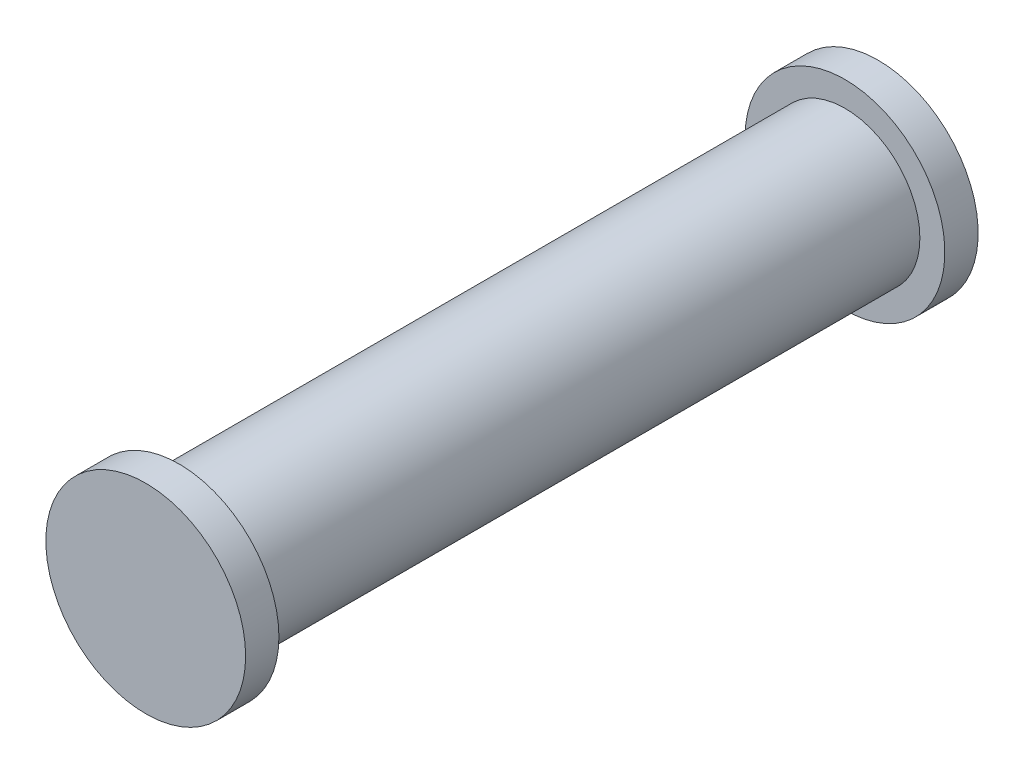
ISO-10303-21;
HEADER;
FILE_DESCRIPTION(('STEP AP214'),'2;1');
FILE_NAME('part.step','',(''),(''),'','','');
FILE_SCHEMA(('AUTOMOTIVE_DESIGN { 1 0 10303 214 1 1 1 1 }'));
ENDSEC;
DATA;
#1=APPLICATION_CONTEXT('core data for automotive mechanical design processes');
#2=APPLICATION_PROTOCOL_DEFINITION('international standard','automotive_design',2000,#1);
#3=PRODUCT_CONTEXT('',#1,'mechanical');
#4=PRODUCT('Part','Part','',(#3));
#5=PRODUCT_RELATED_PRODUCT_CATEGORY('part','',(#4));
#6=PRODUCT_DEFINITION_FORMATION('','',#4);
#7=PRODUCT_DEFINITION_CONTEXT('part definition',#1,'design');
#8=PRODUCT_DEFINITION('design','',#6,#7);
#9=PRODUCT_DEFINITION_SHAPE('','',#8);
#10=(LENGTH_UNIT() NAMED_UNIT(*) SI_UNIT(.MILLI.,.METRE.));
#11=(NAMED_UNIT(*) PLANE_ANGLE_UNIT() SI_UNIT($,.RADIAN.));
#12=(NAMED_UNIT(*) SI_UNIT($,.STERADIAN.) SOLID_ANGLE_UNIT());
#13=UNCERTAINTY_MEASURE_WITH_UNIT(LENGTH_MEASURE(1.E-05),#10,'distance_accuracy_value','');
#14=(GEOMETRIC_REPRESENTATION_CONTEXT(3) GLOBAL_UNCERTAINTY_ASSIGNED_CONTEXT((#13)) GLOBAL_UNIT_ASSIGNED_CONTEXT((#10,
#11,#12)) REPRESENTATION_CONTEXT('',''));
#15=CARTESIAN_POINT('',(0.,0.,0.));
#16=DIRECTION('',(0.,0.,1.));
#17=DIRECTION('',(1.,0.,0.));
#18=AXIS2_PLACEMENT_3D('',#15,#16,#17);
#19=CARTESIAN_POINT('',(-14.9,15.1,-26.363961030679));
#20=DIRECTION('',(0.,0.,1.));
#21=DIRECTION('',(1.,0.,0.));
#22=AXIS2_PLACEMENT_3D('',#19,#20,#21);
#23=CYLINDRICAL_SURFACE('',#22,2.25);
#24=CARTESIAN_POINT('',(-14.9,15.1,-20.0000000000001));
#25=DIRECTION('',(0.,0.,1.));
#26=DIRECTION('',(1.,0.,0.));
#27=AXIS2_PLACEMENT_3D('',#24,#25,#26);
#28=CIRCLE('',#27,2.25);
#29=CARTESIAN_POINT('',(-12.65,15.1,-20.0000000000001));
#30=VERTEX_POINT('',#29);
#31=EDGE_CURVE('E10',#30,#30,#28,.F.);
#32=CARTESIAN_POINT('',(-14.9,15.1,0.));
#33=DIRECTION('',(0.,0.,1.));
#34=DIRECTION('',(1.,0.,0.));
#35=AXIS2_PLACEMENT_3D('',#32,#33,#34);
#36=CIRCLE('',#35,2.25);
#37=CARTESIAN_POINT('',(-12.65,15.1,0.));
#38=VERTEX_POINT('',#37);
#39=EDGE_CURVE('E36',#38,#38,#36,.T.);
#40=CARTESIAN_POINT('',(-12.65,15.1,-20.0000000000001));
#41=CARTESIAN_POINT('',(-12.65,15.1,-19.7916666666668));
#42=CARTESIAN_POINT('',(-12.65,15.1,-19.5833333333334));
#43=CARTESIAN_POINT('',(-12.65,15.1,-19.1666666666668));
#44=CARTESIAN_POINT('',(-12.65,15.1,-18.9583333333334));
#45=CARTESIAN_POINT('',(-12.65,15.1,-18.5416666666668));
#46=CARTESIAN_POINT('',(-12.65,15.1,-18.3333333333334));
#47=CARTESIAN_POINT('',(-12.65,15.1,-17.9166666666667));
#48=CARTESIAN_POINT('',(-12.65,15.1,-17.7083333333334));
#49=CARTESIAN_POINT('',(-12.65,15.1,-17.2916666666667));
#50=CARTESIAN_POINT('',(-12.65,15.1,-17.0833333333334));
#51=CARTESIAN_POINT('',(-12.65,15.1,-16.6666666666667));
#52=CARTESIAN_POINT('',(-12.65,15.1,-16.4583333333334));
#53=CARTESIAN_POINT('',(-12.65,15.1,-16.0416666666667));
#54=CARTESIAN_POINT('',(-12.65,15.1,-15.8333333333334));
#55=CARTESIAN_POINT('',(-12.65,15.1,-15.4166666666667));
#56=CARTESIAN_POINT('',(-12.65,15.1,-15.2083333333334));
#57=CARTESIAN_POINT('',(-12.65,15.1,-14.7916666666667));
#58=CARTESIAN_POINT('',(-12.65,15.1,-14.5833333333334));
#59=CARTESIAN_POINT('',(-12.65,15.1,-14.1666666666667));
#60=CARTESIAN_POINT('',(-12.65,15.1,-13.9583333333334));
#61=CARTESIAN_POINT('',(-12.65,15.1,-13.5416666666667));
#62=CARTESIAN_POINT('',(-12.65,15.1,-13.3333333333334));
#63=CARTESIAN_POINT('',(-12.65,15.1,-12.9166666666667));
#64=CARTESIAN_POINT('',(-12.65,15.1,-12.7083333333334));
#65=CARTESIAN_POINT('',(-12.65,15.1,-12.2916666666667));
#66=CARTESIAN_POINT('',(-12.65,15.1,-12.0833333333334));
#67=CARTESIAN_POINT('',(-12.65,15.1,-11.6666666666667));
#68=CARTESIAN_POINT('',(-12.65,15.1,-11.4583333333334));
#69=CARTESIAN_POINT('',(-12.65,15.1,-11.0416666666667));
#70=CARTESIAN_POINT('',(-12.65,15.1,-10.8333333333334));
#71=CARTESIAN_POINT('',(-12.65,15.1,-10.4166666666667));
#72=CARTESIAN_POINT('',(-12.65,15.1,-10.2083333333334));
#73=CARTESIAN_POINT('',(-12.65,15.1,-9.79166666666671));
#74=CARTESIAN_POINT('',(-12.65,15.1,-9.58333333333338));
#75=CARTESIAN_POINT('',(-12.65,15.1,-9.16666666666671));
#76=CARTESIAN_POINT('',(-12.65,15.1,-8.95833333333338));
#77=CARTESIAN_POINT('',(-12.65,15.1,-8.54166666666671));
#78=CARTESIAN_POINT('',(-12.65,15.1,-8.33333333333337));
#79=CARTESIAN_POINT('',(-12.65,15.1,-7.91666666666671));
#80=CARTESIAN_POINT('',(-12.65,15.1,-7.70833333333337));
#81=CARTESIAN_POINT('',(-12.65,15.1,-7.2916666666667));
#82=CARTESIAN_POINT('',(-12.65,15.1,-7.08333333333337));
#83=CARTESIAN_POINT('',(-12.65,15.1,-6.6666666666667));
#84=CARTESIAN_POINT('',(-12.65,15.1,-6.45833333333337));
#85=CARTESIAN_POINT('',(-12.65,15.1,-6.0416666666667));
#86=CARTESIAN_POINT('',(-12.65,15.1,-5.83333333333336));
#87=CARTESIAN_POINT('',(-12.65,15.1,-5.4166666666667));
#88=CARTESIAN_POINT('',(-12.65,15.1,-5.20833333333336));
#89=CARTESIAN_POINT('',(-12.65,15.1,-4.79166666666669));
#90=CARTESIAN_POINT('',(-12.65,15.1,-4.58333333333336));
#91=CARTESIAN_POINT('',(-12.65,15.1,-4.16666666666669));
#92=CARTESIAN_POINT('',(-12.65,15.1,-3.95833333333335));
#93=CARTESIAN_POINT('',(-12.65,15.1,-3.54166666666669));
#94=CARTESIAN_POINT('',(-12.65,15.1,-3.33333333333335));
#95=CARTESIAN_POINT('',(-12.65,15.1,-2.91666666666668));
#96=CARTESIAN_POINT('',(-12.65,15.1,-2.70833333333335));
#97=CARTESIAN_POINT('',(-12.65,15.1,-2.29166666666668));
#98=CARTESIAN_POINT('',(-12.65,15.1,-2.08333333333335));
#99=CARTESIAN_POINT('',(-12.65,15.1,-1.66666666666668));
#100=CARTESIAN_POINT('',(-12.65,15.1,-1.45833333333335));
#101=CARTESIAN_POINT('',(-12.65,15.1,-1.04166666666668));
#102=CARTESIAN_POINT('',(-12.65,15.1,-0.833333333333344));
#103=CARTESIAN_POINT('',(-12.65,15.1,-0.416666666666675));
#104=CARTESIAN_POINT('',(-12.65,15.1,-0.20833333333334));
#105=CARTESIAN_POINT('',(-12.65,15.1,0.));
#106=B_SPLINE_CURVE_WITH_KNOTS('',3,(#40,#41,#42,#43,#44,#45,#46,#47,#48,#49,#50,#51,#52,#53,
#54,#55,#56,#57,#58,#59,#60,#61,#62,#63,#64,#65,#66,#67,#68,#69,#70,#71,#72,#73,#74,#75,#76,#77,
#78,#79,#80,#81,#82,#83,#84,#85,#86,#87,#88,#89,#90,#91,#92,#93,#94,#95,#96,#97,#98,#99,#100,
#101,#102,#103,#104,#105),.UNSPECIFIED.,.F.,.F.,(4,2,2,2,2,2,2,2,2,2,2,2,2,2,2,2,2,2,2,2,2,2,2,
2,2,2,2,2,2,2,2,2,4),(0.,0.625000000000004,1.25,1.87500000000001,2.50000000000001,
3.12500000000001,3.75000000000001,4.37500000000002,5.00000000000002,5.62500000000002,
6.25000000000003,6.87500000000003,7.50000000000003,8.12500000000004,8.75000000000004,
9.37500000000004,10.,10.625,11.25,11.8750000000001,12.5000000000001,13.1250000000001,
13.7500000000001,14.3750000000001,15.0000000000001,15.6250000000001,16.2500000000001,
16.8750000000001,17.5000000000001,18.1250000000001,18.7500000000001,19.3750000000001,
20.0000000000001),.UNSPECIFIED.);
#107=EDGE_CURVE('BSEAM30',#30,#38,#106,.T.);
#108=ORIENTED_EDGE('',*,*,#31,.F.);
#109=ORIENTED_EDGE('',*,*,#39,.F.);
#110=ORIENTED_EDGE('',*,*,#107,.T.);
#111=ORIENTED_EDGE('',*,*,#107,.F.);
#112=EDGE_LOOP('',(#108,#110,#109,#111));
#113=FACE_BOUND('',#112,.T.);
#114=ADVANCED_FACE('F30',(#113),#23,.T.);
#115=CARTESIAN_POINT('',(-14.9,15.1,1.));
#116=DIRECTION('',(0.,0.,-1.));
#117=DIRECTION('',(-1.,0.,0.));
#118=AXIS2_PLACEMENT_3D('',#115,#116,#117);
#119=CYLINDRICAL_SURFACE('',#118,3.);
#120=CARTESIAN_POINT('',(-14.9,15.1,1.));
#121=DIRECTION('',(0.,0.,1.));
#122=DIRECTION('',(1.,0.,0.));
#123=AXIS2_PLACEMENT_3D('',#120,#121,#122);
#124=CIRCLE('',#123,3.);
#125=CARTESIAN_POINT('',(-11.9,15.1,1.));
#126=VERTEX_POINT('',#125);
#127=EDGE_CURVE('E40',#126,#126,#124,.T.);
#128=ORIENTED_EDGE('',*,*,#127,.F.);
#129=EDGE_LOOP('',(#128));
#130=FACE_BOUND('',#129,.T.);
#131=CARTESIAN_POINT('',(-14.9,15.1,0.));
#132=DIRECTION('',(0.,0.,1.));
#133=DIRECTION('',(1.,0.,0.));
#134=AXIS2_PLACEMENT_3D('',#131,#132,#133);
#135=CIRCLE('',#134,3.);
#136=CARTESIAN_POINT('',(-11.9,15.1,0.));
#137=VERTEX_POINT('',#136);
#138=EDGE_CURVE('E44',#137,#137,#135,.T.);
#139=ORIENTED_EDGE('',*,*,#138,.T.);
#140=EDGE_LOOP('',(#139));
#141=FACE_BOUND('',#140,.T.);
#142=ADVANCED_FACE('F73',(#130,#141),#119,.T.);
#143=CARTESIAN_POINT('',(-14.9,15.1,1.));
#144=DIRECTION('',(0.,0.,1.));
#145=DIRECTION('',(1.,0.,0.));
#146=AXIS2_PLACEMENT_3D('',#143,#144,#145);
#147=PLANE('',#146);
#148=ORIENTED_EDGE('',*,*,#127,.T.);
#149=EDGE_LOOP('',(#148));
#150=FACE_BOUND('',#149,.T.);
#151=ADVANCED_FACE('F78',(#150),#147,.T.);
#152=CARTESIAN_POINT('',(-14.9,15.1,0.));
#153=DIRECTION('',(0.,0.,1.));
#154=DIRECTION('',(1.,0.,0.));
#155=AXIS2_PLACEMENT_3D('',#152,#153,#154);
#156=PLANE('',#155);
#157=ORIENTED_EDGE('',*,*,#39,.T.);
#158=EDGE_LOOP('',(#157));
#159=FACE_BOUND('',#158,.T.);
#160=ORIENTED_EDGE('',*,*,#138,.F.);
#161=EDGE_LOOP('',(#160));
#162=FACE_BOUND('',#161,.T.);
#163=ADVANCED_FACE('F61',(#159,#162),#156,.F.);
#164=CARTESIAN_POINT('',(-14.9000000000001,15.1,-21.0000000000001));
#165=DIRECTION('',(0.,0.,1.));
#166=DIRECTION('',(1.,0.,0.));
#167=AXIS2_PLACEMENT_3D('',#164,#165,#166);
#168=CYLINDRICAL_SURFACE('',#167,3.);
#169=CARTESIAN_POINT('',(-14.9000000000001,15.1,-21.0000000000001));
#170=DIRECTION('',(0.,0.,-1.));
#171=DIRECTION('',(-1.,0.,0.));
#172=AXIS2_PLACEMENT_3D('',#169,#170,#171);
#173=CIRCLE('',#172,3.);
#174=CARTESIAN_POINT('',(-17.9000000000001,15.1,-21.0000000000001));
#175=VERTEX_POINT('',#174);
#176=EDGE_CURVE('E48',#175,#175,#173,.T.);
#177=ORIENTED_EDGE('',*,*,#176,.F.);
#178=EDGE_LOOP('',(#177));
#179=FACE_BOUND('',#178,.T.);
#180=CARTESIAN_POINT('',(-14.9000000000001,15.1,-20.0000000000001));
#181=DIRECTION('',(0.,0.,-1.));
#182=DIRECTION('',(-1.,0.,0.));
#183=AXIS2_PLACEMENT_3D('',#180,#181,#182);
#184=CIRCLE('',#183,3.);
#185=CARTESIAN_POINT('',(-17.9000000000001,15.1,-20.0000000000001));
#186=VERTEX_POINT('',#185);
#187=EDGE_CURVE('E50',#186,#186,#184,.T.);
#188=ORIENTED_EDGE('',*,*,#187,.T.);
#189=EDGE_LOOP('',(#188));
#190=FACE_BOUND('',#189,.T.);
#191=ADVANCED_FACE('F58',(#179,#190),#168,.T.);
#192=CARTESIAN_POINT('',(-14.9000000000001,15.1,-21.0000000000001));
#193=DIRECTION('',(0.,0.,-1.));
#194=DIRECTION('',(-1.,0.,0.));
#195=AXIS2_PLACEMENT_3D('',#192,#193,#194);
#196=PLANE('',#195);
#197=ORIENTED_EDGE('',*,*,#176,.T.);
#198=EDGE_LOOP('',(#197));
#199=FACE_BOUND('',#198,.T.);
#200=ADVANCED_FACE('F56',(#199),#196,.T.);
#201=CARTESIAN_POINT('',(-14.9000000000001,15.1,-20.0000000000001));
#202=DIRECTION('',(0.,0.,-1.));
#203=DIRECTION('',(-1.,0.,0.));
#204=AXIS2_PLACEMENT_3D('',#201,#202,#203);
#205=PLANE('',#204);
#206=ORIENTED_EDGE('',*,*,#31,.T.);
#207=EDGE_LOOP('',(#206));
#208=FACE_BOUND('',#207,.T.);
#209=ORIENTED_EDGE('',*,*,#187,.F.);
#210=EDGE_LOOP('',(#209));
#211=FACE_BOUND('',#210,.T.);
#212=ADVANCED_FACE('F65',(#208,#211),#205,.F.);
#213=CLOSED_SHELL('',(#114,#142,#151,#163,#191,#200,#212));
#214=MANIFOLD_SOLID_BREP('B2',#213);
#215=ADVANCED_BREP_SHAPE_REPRESENTATION('',(#18,#214),#14);
#216=SHAPE_DEFINITION_REPRESENTATION(#9,#215);
ENDSEC;
END-ISO-10303-21;
